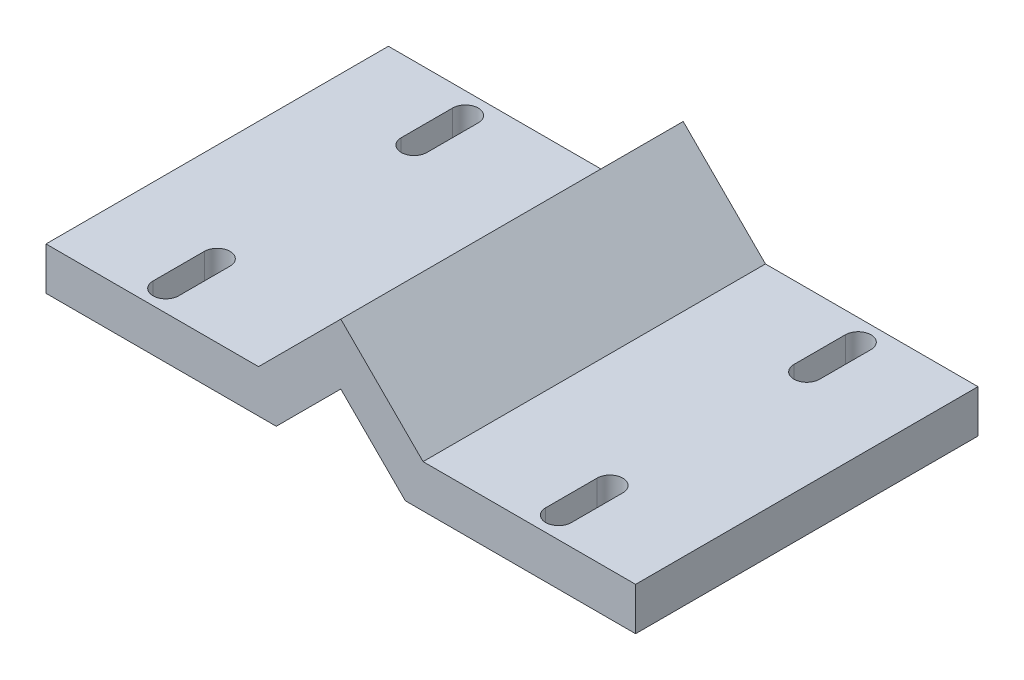
ISO-10303-21;
HEADER;
FILE_DESCRIPTION(('STEP AP214'),'2;1');
FILE_NAME('part.step','',(''),(''),'','','');
FILE_SCHEMA(('AUTOMOTIVE_DESIGN { 1 0 10303 214 1 1 1 1 }'));
ENDSEC;
DATA;
#1=APPLICATION_CONTEXT('core data for automotive mechanical design processes');
#2=APPLICATION_PROTOCOL_DEFINITION('international standard','automotive_design',2000,#1);
#3=PRODUCT_CONTEXT('',#1,'mechanical');
#4=PRODUCT('Part','Part','',(#3));
#5=PRODUCT_RELATED_PRODUCT_CATEGORY('part','',(#4));
#6=PRODUCT_DEFINITION_FORMATION('','',#4);
#7=PRODUCT_DEFINITION_CONTEXT('part definition',#1,'design');
#8=PRODUCT_DEFINITION('design','',#6,#7);
#9=PRODUCT_DEFINITION_SHAPE('','',#8);
#10=(LENGTH_UNIT() NAMED_UNIT(*) SI_UNIT(.MILLI.,.METRE.));
#11=(NAMED_UNIT(*) PLANE_ANGLE_UNIT() SI_UNIT($,.RADIAN.));
#12=(NAMED_UNIT(*) SI_UNIT($,.STERADIAN.) SOLID_ANGLE_UNIT());
#13=UNCERTAINTY_MEASURE_WITH_UNIT(LENGTH_MEASURE(1.E-05),#10,'distance_accuracy_value','');
#14=(GEOMETRIC_REPRESENTATION_CONTEXT(3) GLOBAL_UNCERTAINTY_ASSIGNED_CONTEXT((#13)) GLOBAL_UNIT_ASSIGNED_CONTEXT((#10,
#11,#12)) REPRESENTATION_CONTEXT('',''));
#15=CARTESIAN_POINT('',(0.,0.,0.));
#16=DIRECTION('',(0.,0.,1.));
#17=DIRECTION('',(1.,0.,0.));
#18=AXIS2_PLACEMENT_3D('',#15,#16,#17);
#19=CARTESIAN_POINT('',(7.53999999999993,-7.54,40.));
#20=DIRECTION('',(0.707106781186551,0.707106781186544,0.));
#21=DIRECTION('',(-0.707106781186544,0.707106781186551,0.));
#22=AXIS2_PLACEMENT_3D('',#19,#20,#21);
#23=PLANE('',#22);
#24=DIRECTION('',(0.707106781186544,-0.707106781186551,0.));
#25=VECTOR('',#24,1.);
#26=CARTESIAN_POINT('',(7.53999999999993,-7.54,0.));
#27=LINE('',#26,#25);
#28=CARTESIAN_POINT('',(0.,0.,0.));
#29=VERTEX_POINT('',#28);
#30=CARTESIAN_POINT('',(7.53999999999993,-7.54,0.));
#31=VERTEX_POINT('',#30);
#32=EDGE_CURVE('E316',#29,#31,#27,.T.);
#33=ORIENTED_EDGE('',*,*,#32,.T.);
#34=DIRECTION('',(0.,0.,-1.));
#35=VECTOR('',#34,1.);
#36=CARTESIAN_POINT('',(7.53999999999993,-7.54,40.));
#37=LINE('',#36,#35);
#38=CARTESIAN_POINT('',(7.53999999999993,-7.54,40.));
#39=VERTEX_POINT('',#38);
#40=EDGE_CURVE('E385',#39,#31,#37,.T.);
#41=ORIENTED_EDGE('',*,*,#40,.F.);
#42=DIRECTION('',(0.707106781186544,-0.707106781186551,0.));
#43=VECTOR('',#42,1.);
#44=CARTESIAN_POINT('',(7.53999999999993,-7.54,40.));
#45=LINE('',#44,#43);
#46=CARTESIAN_POINT('',(0.,0.,40.));
#47=VERTEX_POINT('',#46);
#48=EDGE_CURVE('E317',#47,#39,#45,.T.);
#49=ORIENTED_EDGE('',*,*,#48,.F.);
#50=DIRECTION('',(0.,0.,-1.));
#51=VECTOR('',#50,1.);
#52=CARTESIAN_POINT('',(0.,0.,40.));
#53=LINE('',#52,#51);
#54=EDGE_CURVE('E339',#47,#29,#53,.T.);
#55=ORIENTED_EDGE('',*,*,#54,.T.);
#56=EDGE_LOOP('',(#33,#41,#49,#55));
#57=FACE_BOUND('',#56,.T.);
#58=ADVANCED_FACE('F37',(#57),#23,.F.);
#59=CARTESIAN_POINT('',(34.4399999999999,-7.54,40.));
#60=DIRECTION('',(0.,1.,0.));
#61=DIRECTION('',(-1.,0.,0.));
#62=AXIS2_PLACEMENT_3D('',#59,#60,#61);
#63=PLANE('',#62);
#64=DIRECTION('',(0.,0.,1.));
#65=VECTOR('',#64,1.);
#66=CARTESIAN_POINT('',(24.4403153493872,-7.54,40.));
#67=LINE('',#66,#65);
#68=CARTESIAN_POINT('',(24.4403153493872,-7.54,31.5));
#69=VERTEX_POINT('',#68);
#70=CARTESIAN_POINT('',(24.4403153493872,-7.54,37.5));
#71=VERTEX_POINT('',#70);
#72=EDGE_CURVE('E311',#69,#71,#67,.T.);
#73=ORIENTED_EDGE('',*,*,#72,.F.);
#74=CARTESIAN_POINT('',(22.9399999999999,-7.54,31.5));
#75=DIRECTION('',(0.,1.,0.));
#76=DIRECTION('',(-1.,0.,0.));
#77=AXIS2_PLACEMENT_3D('',#74,#75,#76);
#78=CIRCLE('',#77,1.50031534938725);
#79=CARTESIAN_POINT('',(21.4396846506127,-7.54,31.5));
#80=VERTEX_POINT('',#79);
#81=EDGE_CURVE('E313',#69,#80,#78,.T.);
#82=ORIENTED_EDGE('',*,*,#81,.T.);
#83=DIRECTION('',(0.,0.,1.));
#84=VECTOR('',#83,1.);
#85=CARTESIAN_POINT('',(21.4396846506127,-7.54,40.));
#86=LINE('',#85,#84);
#87=CARTESIAN_POINT('',(21.4396846506127,-7.54,37.5));
#88=VERTEX_POINT('',#87);
#89=EDGE_CURVE('E305',#80,#88,#86,.T.);
#90=ORIENTED_EDGE('',*,*,#89,.T.);
#91=CARTESIAN_POINT('',(22.9399999999999,-7.54,37.5));
#92=DIRECTION('',(0.,1.,0.));
#93=DIRECTION('',(-1.,0.,0.));
#94=AXIS2_PLACEMENT_3D('',#91,#92,#93);
#95=CIRCLE('',#94,1.50031534938725);
#96=EDGE_CURVE('E308',#88,#71,#95,.T.);
#97=ORIENTED_EDGE('',*,*,#96,.T.);
#98=EDGE_LOOP('',(#73,#82,#90,#97));
#99=FACE_BOUND('',#98,.T.);
#100=CARTESIAN_POINT('',(22.9399999999999,-7.54,2.5));
#101=DIRECTION('',(0.,1.,0.));
#102=DIRECTION('',(-1.,0.,0.));
#103=AXIS2_PLACEMENT_3D('',#100,#101,#102);
#104=CIRCLE('',#103,1.50031534938725);
#105=CARTESIAN_POINT('',(24.4403153493872,-7.54,2.5));
#106=VERTEX_POINT('',#105);
#107=CARTESIAN_POINT('',(21.4396846506127,-7.54,2.5));
#108=VERTEX_POINT('',#107);
#109=EDGE_CURVE('E302',#106,#108,#104,.T.);
#110=ORIENTED_EDGE('',*,*,#109,.T.);
#111=DIRECTION('',(0.,0.,1.));
#112=VECTOR('',#111,1.);
#113=CARTESIAN_POINT('',(21.4396846506127,-7.54,40.));
#114=LINE('',#113,#112);
#115=CARTESIAN_POINT('',(21.4396846506127,-7.54,8.5));
#116=VERTEX_POINT('',#115);
#117=EDGE_CURVE('E216',#108,#116,#114,.T.);
#118=ORIENTED_EDGE('',*,*,#117,.T.);
#119=CARTESIAN_POINT('',(22.9399999999999,-7.54,8.5));
#120=DIRECTION('',(0.,1.,0.));
#121=DIRECTION('',(-1.,0.,0.));
#122=AXIS2_PLACEMENT_3D('',#119,#120,#121);
#123=CIRCLE('',#122,1.50031534938725);
#124=CARTESIAN_POINT('',(24.4403153493872,-7.54,8.5));
#125=VERTEX_POINT('',#124);
#126=EDGE_CURVE('E291',#116,#125,#123,.T.);
#127=ORIENTED_EDGE('',*,*,#126,.T.);
#128=DIRECTION('',(0.,0.,1.));
#129=VECTOR('',#128,1.);
#130=CARTESIAN_POINT('',(24.4403153493872,-7.54,40.));
#131=LINE('',#130,#129);
#132=EDGE_CURVE('E300',#106,#125,#131,.T.);
#133=ORIENTED_EDGE('',*,*,#132,.F.);
#134=EDGE_LOOP('',(#110,#118,#127,#133));
#135=FACE_BOUND('',#134,.T.);
#136=DIRECTION('',(1.,0.,0.));
#137=VECTOR('',#136,1.);
#138=CARTESIAN_POINT('',(34.4399999999999,-7.54,0.));
#139=LINE('',#138,#137);
#140=CARTESIAN_POINT('',(34.4399999999999,-7.54,0.));
#141=VERTEX_POINT('',#140);
#142=EDGE_CURVE('E342',#31,#141,#139,.T.);
#143=ORIENTED_EDGE('',*,*,#142,.T.);
#144=DIRECTION('',(0.,0.,-1.));
#145=VECTOR('',#144,1.);
#146=CARTESIAN_POINT('',(34.4399999999999,-7.54,40.));
#147=LINE('',#146,#145);
#148=CARTESIAN_POINT('',(34.4399999999999,-7.54,40.));
#149=VERTEX_POINT('',#148);
#150=EDGE_CURVE('E382',#149,#141,#147,.T.);
#151=ORIENTED_EDGE('',*,*,#150,.F.);
#152=DIRECTION('',(1.,0.,0.));
#153=VECTOR('',#152,1.);
#154=CARTESIAN_POINT('',(34.4399999999999,-7.54,40.));
#155=LINE('',#154,#153);
#156=EDGE_CURVE('E320',#39,#149,#155,.T.);
#157=ORIENTED_EDGE('',*,*,#156,.F.);
#158=ORIENTED_EDGE('',*,*,#40,.T.);
#159=EDGE_LOOP('',(#143,#151,#157,#158));
#160=FACE_BOUND('',#159,.T.);
#161=ADVANCED_FACE('F438',(#99,#135,#160),#63,.F.);
#162=CARTESIAN_POINT('',(34.4399999999999,-2.54,40.));
#163=DIRECTION('',(-1.,0.,0.));
#164=DIRECTION('',(0.,-1.,0.));
#165=AXIS2_PLACEMENT_3D('',#162,#163,#164);
#166=PLANE('',#165);
#167=DIRECTION('',(0.,1.,0.));
#168=VECTOR('',#167,1.);
#169=CARTESIAN_POINT('',(34.4399999999999,-2.54,0.));
#170=LINE('',#169,#168);
#171=CARTESIAN_POINT('',(34.4399999999999,-2.54,0.));
#172=VERTEX_POINT('',#171);
#173=EDGE_CURVE('E344',#141,#172,#170,.T.);
#174=ORIENTED_EDGE('',*,*,#173,.T.);
#175=DIRECTION('',(0.,0.,-1.));
#176=VECTOR('',#175,1.);
#177=CARTESIAN_POINT('',(34.4399999999999,-2.54,40.));
#178=LINE('',#177,#176);
#179=CARTESIAN_POINT('',(34.4399999999999,-2.54,40.));
#180=VERTEX_POINT('',#179);
#181=EDGE_CURVE('E379',#180,#172,#178,.T.);
#182=ORIENTED_EDGE('',*,*,#181,.F.);
#183=DIRECTION('',(0.,1.,0.));
#184=VECTOR('',#183,1.);
#185=CARTESIAN_POINT('',(34.4399999999999,-2.54,40.));
#186=LINE('',#185,#184);
#187=EDGE_CURVE('E323',#149,#180,#186,.T.);
#188=ORIENTED_EDGE('',*,*,#187,.F.);
#189=ORIENTED_EDGE('',*,*,#150,.T.);
#190=EDGE_LOOP('',(#174,#182,#188,#189));
#191=FACE_BOUND('',#190,.T.);
#192=ADVANCED_FACE('F443',(#191),#166,.F.);
#193=CARTESIAN_POINT('',(9.61106781186541,-2.54,40.));
#194=DIRECTION('',(0.,-1.,0.));
#195=DIRECTION('',(0.,0.,-1.));
#196=AXIS2_PLACEMENT_3D('',#193,#194,#195);
#197=PLANE('',#196);
#198=DIRECTION('',(0.,0.,1.));
#199=VECTOR('',#198,1.);
#200=CARTESIAN_POINT('',(21.4396846506127,-2.54,31.5));
#201=LINE('',#200,#199);
#202=CARTESIAN_POINT('',(21.4396846506127,-2.54,31.5));
#203=VERTEX_POINT('',#202);
#204=CARTESIAN_POINT('',(21.4396846506127,-2.54,37.5));
#205=VERTEX_POINT('',#204);
#206=EDGE_CURVE('E277',#203,#205,#201,.T.);
#207=ORIENTED_EDGE('',*,*,#206,.F.);
#208=CARTESIAN_POINT('',(22.9399999999999,-2.54,31.5));
#209=DIRECTION('',(0.,1.,0.));
#210=DIRECTION('',(0.,0.,1.));
#211=AXIS2_PLACEMENT_3D('',#208,#209,#210);
#212=CIRCLE('',#211,1.50031534938725);
#213=CARTESIAN_POINT('',(24.4403153493872,-2.54,31.5));
#214=VERTEX_POINT('',#213);
#215=EDGE_CURVE('E253',#214,#203,#212,.T.);
#216=ORIENTED_EDGE('',*,*,#215,.F.);
#217=DIRECTION('',(0.,0.,1.));
#218=VECTOR('',#217,1.);
#219=CARTESIAN_POINT('',(24.4403153493872,-2.54,31.5));
#220=LINE('',#219,#218);
#221=CARTESIAN_POINT('',(24.4403153493872,-2.54,37.5));
#222=VERTEX_POINT('',#221);
#223=EDGE_CURVE('E266',#214,#222,#220,.T.);
#224=ORIENTED_EDGE('',*,*,#223,.T.);
#225=CARTESIAN_POINT('',(22.9399999999999,-2.54,37.5));
#226=DIRECTION('',(0.,1.,0.));
#227=DIRECTION('',(0.,0.,1.));
#228=AXIS2_PLACEMENT_3D('',#225,#226,#227);
#229=CIRCLE('',#228,1.50031534938725);
#230=EDGE_CURVE('E274',#205,#222,#229,.T.);
#231=ORIENTED_EDGE('',*,*,#230,.F.);
#232=EDGE_LOOP('',(#207,#216,#224,#231));
#233=FACE_BOUND('',#232,.T.);
#234=CARTESIAN_POINT('',(22.9399999999999,-2.54,8.5));
#235=DIRECTION('',(0.,1.,0.));
#236=DIRECTION('',(0.,0.,1.));
#237=AXIS2_PLACEMENT_3D('',#234,#235,#236);
#238=CIRCLE('',#237,1.50031534938725);
#239=CARTESIAN_POINT('',(21.4396846506127,-2.54,8.5));
#240=VERTEX_POINT('',#239);
#241=CARTESIAN_POINT('',(24.4403153493872,-2.54,8.5));
#242=VERTEX_POINT('',#241);
#243=EDGE_CURVE('E235',#240,#242,#238,.T.);
#244=ORIENTED_EDGE('',*,*,#243,.F.);
#245=DIRECTION('',(0.,0.,1.));
#246=VECTOR('',#245,1.);
#247=CARTESIAN_POINT('',(21.4396846506127,-2.54,0.));
#248=LINE('',#247,#246);
#249=CARTESIAN_POINT('',(21.4396846506127,-2.54,2.5));
#250=VERTEX_POINT('',#249);
#251=EDGE_CURVE('E213',#250,#240,#248,.T.);
#252=ORIENTED_EDGE('',*,*,#251,.F.);
#253=CARTESIAN_POINT('',(22.9399999999999,-2.54,2.5));
#254=DIRECTION('',(0.,1.,0.));
#255=DIRECTION('',(0.,0.,1.));
#256=AXIS2_PLACEMENT_3D('',#253,#254,#255);
#257=CIRCLE('',#256,1.50031534938725);
#258=CARTESIAN_POINT('',(24.4403153493872,-2.54,2.5));
#259=VERTEX_POINT('',#258);
#260=EDGE_CURVE('E223',#259,#250,#257,.T.);
#261=ORIENTED_EDGE('',*,*,#260,.F.);
#262=DIRECTION('',(0.,0.,1.));
#263=VECTOR('',#262,1.);
#264=CARTESIAN_POINT('',(24.4403153493872,-2.54,0.));
#265=LINE('',#264,#263);
#266=EDGE_CURVE('E229',#259,#242,#265,.T.);
#267=ORIENTED_EDGE('',*,*,#266,.T.);
#268=EDGE_LOOP('',(#244,#252,#261,#267));
#269=FACE_BOUND('',#268,.T.);
#270=DIRECTION('',(-1.,0.,0.));
#271=VECTOR('',#270,1.);
#272=CARTESIAN_POINT('',(9.61106781186541,-2.54,0.));
#273=LINE('',#272,#271);
#274=CARTESIAN_POINT('',(9.61106781186541,-2.54,0.));
#275=VERTEX_POINT('',#274);
#276=EDGE_CURVE('E346',#172,#275,#273,.T.);
#277=ORIENTED_EDGE('',*,*,#276,.T.);
#278=DIRECTION('',(0.,0.,-1.));
#279=VECTOR('',#278,1.);
#280=CARTESIAN_POINT('',(9.61106781186541,-2.54,40.));
#281=LINE('',#280,#279);
#282=CARTESIAN_POINT('',(9.61106781186541,-2.54,40.));
#283=VERTEX_POINT('',#282);
#284=EDGE_CURVE('E376',#283,#275,#281,.T.);
#285=ORIENTED_EDGE('',*,*,#284,.F.);
#286=DIRECTION('',(-1.,0.,0.));
#287=VECTOR('',#286,1.);
#288=CARTESIAN_POINT('',(9.61106781186541,-2.54,40.));
#289=LINE('',#288,#287);
#290=EDGE_CURVE('E325',#180,#283,#289,.T.);
#291=ORIENTED_EDGE('',*,*,#290,.F.);
#292=ORIENTED_EDGE('',*,*,#181,.T.);
#293=EDGE_LOOP('',(#277,#285,#291,#292));
#294=FACE_BOUND('',#293,.T.);
#295=ADVANCED_FACE('F233',(#233,#269,#294),#197,.F.);
#296=CARTESIAN_POINT('',(0.,7.07106781186549,40.));
#297=DIRECTION('',(-0.707106781186551,-0.707106781186544,0.));
#298=DIRECTION('',(0.707106781186544,-0.707106781186551,0.));
#299=AXIS2_PLACEMENT_3D('',#296,#297,#298);
#300=PLANE('',#299);
#301=DIRECTION('',(-0.707106781186544,0.707106781186551,0.));
#302=VECTOR('',#301,1.);
#303=CARTESIAN_POINT('',(0.,7.07106781186549,0.));
#304=LINE('',#303,#302);
#305=CARTESIAN_POINT('',(0.,7.07106781186549,0.));
#306=VERTEX_POINT('',#305);
#307=EDGE_CURVE('E348',#275,#306,#304,.T.);
#308=ORIENTED_EDGE('',*,*,#307,.T.);
#309=DIRECTION('',(0.,0.,-1.));
#310=VECTOR('',#309,1.);
#311=CARTESIAN_POINT('',(0.,7.07106781186549,40.));
#312=LINE('',#311,#310);
#313=CARTESIAN_POINT('',(0.,7.07106781186549,40.));
#314=VERTEX_POINT('',#313);
#315=EDGE_CURVE('E373',#314,#306,#312,.T.);
#316=ORIENTED_EDGE('',*,*,#315,.F.);
#317=DIRECTION('',(-0.707106781186544,0.707106781186551,0.));
#318=VECTOR('',#317,1.);
#319=CARTESIAN_POINT('',(0.,7.07106781186549,40.));
#320=LINE('',#319,#318);
#321=EDGE_CURVE('E327',#283,#314,#320,.T.);
#322=ORIENTED_EDGE('',*,*,#321,.F.);
#323=ORIENTED_EDGE('',*,*,#284,.T.);
#324=EDGE_LOOP('',(#308,#316,#322,#323));
#325=FACE_BOUND('',#324,.T.);
#326=ADVANCED_FACE('F483',(#325),#300,.F.);
#327=CARTESIAN_POINT('',(-9.6110678118655,-2.54,40.));
#328=DIRECTION('',(0.707106781186546,-0.707106781186549,0.));
#329=DIRECTION('',(0.707106781186549,0.707106781186546,0.));
#330=AXIS2_PLACEMENT_3D('',#327,#328,#329);
#331=PLANE('',#330);
#332=DIRECTION('',(-0.707106781186549,-0.707106781186546,0.));
#333=VECTOR('',#332,1.);
#334=CARTESIAN_POINT('',(-9.6110678118655,-2.54,0.));
#335=LINE('',#334,#333);
#336=CARTESIAN_POINT('',(-9.6110678118655,-2.54,0.));
#337=VERTEX_POINT('',#336);
#338=EDGE_CURVE('E350',#306,#337,#335,.T.);
#339=ORIENTED_EDGE('',*,*,#338,.T.);
#340=DIRECTION('',(0.,0.,-1.));
#341=VECTOR('',#340,1.);
#342=CARTESIAN_POINT('',(-9.6110678118655,-2.54,40.));
#343=LINE('',#342,#341);
#344=CARTESIAN_POINT('',(-9.6110678118655,-2.54,40.));
#345=VERTEX_POINT('',#344);
#346=EDGE_CURVE('E370',#345,#337,#343,.T.);
#347=ORIENTED_EDGE('',*,*,#346,.F.);
#348=DIRECTION('',(-0.707106781186549,-0.707106781186546,0.));
#349=VECTOR('',#348,1.);
#350=CARTESIAN_POINT('',(-9.6110678118655,-2.54,40.));
#351=LINE('',#350,#349);
#352=EDGE_CURVE('E329',#314,#345,#351,.T.);
#353=ORIENTED_EDGE('',*,*,#352,.F.);
#354=ORIENTED_EDGE('',*,*,#315,.T.);
#355=EDGE_LOOP('',(#339,#347,#353,#354));
#356=FACE_BOUND('',#355,.T.);
#357=ADVANCED_FACE('F479',(#356),#331,.F.);
#358=CARTESIAN_POINT('',(-34.44,-2.54,40.));
#359=DIRECTION('',(0.,-1.,0.));
#360=DIRECTION('',(0.,0.,-1.));
#361=AXIS2_PLACEMENT_3D('',#358,#359,#360);
#362=PLANE('',#361);
#363=CARTESIAN_POINT('',(-22.94,-2.54,8.5));
#364=DIRECTION('',(0.,1.,0.));
#365=DIRECTION('',(0.,0.,1.));
#366=AXIS2_PLACEMENT_3D('',#363,#364,#365);
#367=CIRCLE('',#366,1.50031534938725);
#368=CARTESIAN_POINT('',(-24.4403153493873,-2.54,8.5));
#369=VERTEX_POINT('',#368);
#370=CARTESIAN_POINT('',(-21.4396846506128,-2.54,8.5));
#371=VERTEX_POINT('',#370);
#372=EDGE_CURVE('E259',#369,#371,#367,.T.);
#373=ORIENTED_EDGE('',*,*,#372,.F.);
#374=DIRECTION('',(0.,0.,1.));
#375=VECTOR('',#374,1.);
#376=CARTESIAN_POINT('',(-24.4403153493873,-2.54,0.));
#377=LINE('',#376,#375);
#378=CARTESIAN_POINT('',(-24.4403153493873,-2.54,2.5));
#379=VERTEX_POINT('',#378);
#380=EDGE_CURVE('E220',#379,#369,#377,.T.);
#381=ORIENTED_EDGE('',*,*,#380,.F.);
#382=CARTESIAN_POINT('',(-22.94,-2.54,2.5));
#383=DIRECTION('',(0.,1.,0.));
#384=DIRECTION('',(0.,0.,1.));
#385=AXIS2_PLACEMENT_3D('',#382,#383,#384);
#386=CIRCLE('',#385,1.50031534938725);
#387=CARTESIAN_POINT('',(-21.4396846506128,-2.54,2.5));
#388=VERTEX_POINT('',#387);
#389=EDGE_CURVE('E246',#388,#379,#386,.T.);
#390=ORIENTED_EDGE('',*,*,#389,.F.);
#391=DIRECTION('',(0.,0.,1.));
#392=VECTOR('',#391,1.);
#393=CARTESIAN_POINT('',(-21.4396846506128,-2.54,0.));
#394=LINE('',#393,#392);
#395=EDGE_CURVE('E256',#388,#371,#394,.T.);
#396=ORIENTED_EDGE('',*,*,#395,.T.);
#397=EDGE_LOOP('',(#373,#381,#390,#396));
#398=FACE_BOUND('',#397,.T.);
#399=CARTESIAN_POINT('',(-22.94,-2.54,37.5));
#400=DIRECTION('',(0.,1.,0.));
#401=DIRECTION('',(0.,0.,1.));
#402=AXIS2_PLACEMENT_3D('',#399,#400,#401);
#403=CIRCLE('',#402,1.50031534938725);
#404=CARTESIAN_POINT('',(-24.4403153493873,-2.54,37.5));
#405=VERTEX_POINT('',#404);
#406=CARTESIAN_POINT('',(-21.4396846506128,-2.54,37.5));
#407=VERTEX_POINT('',#406);
#408=EDGE_CURVE('E238',#405,#407,#403,.T.);
#409=ORIENTED_EDGE('',*,*,#408,.F.);
#410=DIRECTION('',(0.,0.,1.));
#411=VECTOR('',#410,1.);
#412=CARTESIAN_POINT('',(-24.4403153493873,-2.54,0.));
#413=LINE('',#412,#411);
#414=CARTESIAN_POINT('',(-24.4403153493873,-2.54,31.5));
#415=VERTEX_POINT('',#414);
#416=EDGE_CURVE('E236',#415,#405,#413,.T.);
#417=ORIENTED_EDGE('',*,*,#416,.F.);
#418=CARTESIAN_POINT('',(-22.94,-2.54,31.5));
#419=DIRECTION('',(0.,1.,0.));
#420=DIRECTION('',(0.,0.,1.));
#421=AXIS2_PLACEMENT_3D('',#418,#419,#420);
#422=CIRCLE('',#421,1.50031534938725);
#423=CARTESIAN_POINT('',(-21.4396846506128,-2.54,31.5));
#424=VERTEX_POINT('',#423);
#425=EDGE_CURVE('E285',#424,#415,#422,.T.);
#426=ORIENTED_EDGE('',*,*,#425,.F.);
#427=DIRECTION('',(0.,0.,1.));
#428=VECTOR('',#427,1.);
#429=CARTESIAN_POINT('',(-21.4396846506128,-2.54,0.));
#430=LINE('',#429,#428);
#431=EDGE_CURVE('E282',#424,#407,#430,.T.);
#432=ORIENTED_EDGE('',*,*,#431,.T.);
#433=EDGE_LOOP('',(#409,#417,#426,#432));
#434=FACE_BOUND('',#433,.T.);
#435=DIRECTION('',(-1.,0.,0.));
#436=VECTOR('',#435,1.);
#437=CARTESIAN_POINT('',(-34.44,-2.54,0.));
#438=LINE('',#437,#436);
#439=CARTESIAN_POINT('',(-34.44,-2.54,0.));
#440=VERTEX_POINT('',#439);
#441=EDGE_CURVE('E352',#337,#440,#438,.T.);
#442=ORIENTED_EDGE('',*,*,#441,.T.);
#443=DIRECTION('',(0.,0.,-1.));
#444=VECTOR('',#443,1.);
#445=CARTESIAN_POINT('',(-34.44,-2.54,40.));
#446=LINE('',#445,#444);
#447=CARTESIAN_POINT('',(-34.44,-2.54,40.));
#448=VERTEX_POINT('',#447);
#449=EDGE_CURVE('E367',#448,#440,#446,.T.);
#450=ORIENTED_EDGE('',*,*,#449,.F.);
#451=DIRECTION('',(-1.,0.,0.));
#452=VECTOR('',#451,1.);
#453=CARTESIAN_POINT('',(-34.44,-2.54,40.));
#454=LINE('',#453,#452);
#455=EDGE_CURVE('E331',#345,#448,#454,.T.);
#456=ORIENTED_EDGE('',*,*,#455,.F.);
#457=ORIENTED_EDGE('',*,*,#346,.T.);
#458=EDGE_LOOP('',(#442,#450,#456,#457));
#459=FACE_BOUND('',#458,.T.);
#460=ADVANCED_FACE('F421',(#398,#434,#459),#362,.F.);
#461=CARTESIAN_POINT('',(-34.44,-7.54,40.));
#462=DIRECTION('',(1.,0.,0.));
#463=DIRECTION('',(0.,0.,-1.));
#464=AXIS2_PLACEMENT_3D('',#461,#462,#463);
#465=PLANE('',#464);
#466=DIRECTION('',(0.,-1.,0.));
#467=VECTOR('',#466,1.);
#468=CARTESIAN_POINT('',(-34.44,-7.54,0.));
#469=LINE('',#468,#467);
#470=CARTESIAN_POINT('',(-34.44,-7.54,0.));
#471=VERTEX_POINT('',#470);
#472=EDGE_CURVE('E354',#440,#471,#469,.T.);
#473=ORIENTED_EDGE('',*,*,#472,.T.);
#474=DIRECTION('',(0.,0.,-1.));
#475=VECTOR('',#474,1.);
#476=CARTESIAN_POINT('',(-34.44,-7.54,40.));
#477=LINE('',#476,#475);
#478=CARTESIAN_POINT('',(-34.44,-7.54,40.));
#479=VERTEX_POINT('',#478);
#480=EDGE_CURVE('E364',#479,#471,#477,.T.);
#481=ORIENTED_EDGE('',*,*,#480,.F.);
#482=DIRECTION('',(0.,-1.,0.));
#483=VECTOR('',#482,1.);
#484=CARTESIAN_POINT('',(-34.44,-7.54,40.));
#485=LINE('',#484,#483);
#486=EDGE_CURVE('E333',#448,#479,#485,.T.);
#487=ORIENTED_EDGE('',*,*,#486,.F.);
#488=ORIENTED_EDGE('',*,*,#449,.T.);
#489=EDGE_LOOP('',(#473,#481,#487,#488));
#490=FACE_BOUND('',#489,.T.);
#491=ADVANCED_FACE('F471',(#490),#465,.F.);
#492=CARTESIAN_POINT('',(-7.54000000000002,-7.54,40.));
#493=DIRECTION('',(0.,1.,0.));
#494=DIRECTION('',(-1.,0.,0.));
#495=AXIS2_PLACEMENT_3D('',#492,#493,#494);
#496=PLANE('',#495);
#497=CARTESIAN_POINT('',(-22.94,-7.54,2.5));
#498=DIRECTION('',(0.,1.,0.));
#499=DIRECTION('',(-1.,0.,0.));
#500=AXIS2_PLACEMENT_3D('',#497,#498,#499);
#501=CIRCLE('',#500,1.50031534938725);
#502=CARTESIAN_POINT('',(-21.4396846506128,-7.54,2.5));
#503=VERTEX_POINT('',#502);
#504=CARTESIAN_POINT('',(-24.4403153493873,-7.54,2.5));
#505=VERTEX_POINT('',#504);
#506=EDGE_CURVE('E44',#503,#505,#501,.T.);
#507=ORIENTED_EDGE('',*,*,#506,.T.);
#508=DIRECTION('',(0.,0.,1.));
#509=VECTOR('',#508,1.);
#510=CARTESIAN_POINT('',(-24.4403153493873,-7.54,40.));
#511=LINE('',#510,#509);
#512=CARTESIAN_POINT('',(-24.4403153493873,-7.54,8.5));
#513=VERTEX_POINT('',#512);
#514=EDGE_CURVE('E11',#505,#513,#511,.T.);
#515=ORIENTED_EDGE('',*,*,#514,.T.);
#516=CARTESIAN_POINT('',(-22.94,-7.54,8.5));
#517=DIRECTION('',(0.,1.,0.));
#518=DIRECTION('',(-1.,0.,0.));
#519=AXIS2_PLACEMENT_3D('',#516,#517,#518);
#520=CIRCLE('',#519,1.50031534938725);
#521=CARTESIAN_POINT('',(-21.4396846506128,-7.54,8.5));
#522=VERTEX_POINT('',#521);
#523=EDGE_CURVE('E400',#513,#522,#520,.T.);
#524=ORIENTED_EDGE('',*,*,#523,.T.);
#525=DIRECTION('',(0.,0.,1.));
#526=VECTOR('',#525,1.);
#527=CARTESIAN_POINT('',(-21.4396846506128,-7.54,40.));
#528=LINE('',#527,#526);
#529=EDGE_CURVE('E403',#503,#522,#528,.T.);
#530=ORIENTED_EDGE('',*,*,#529,.F.);
#531=EDGE_LOOP('',(#507,#515,#524,#530));
#532=FACE_BOUND('',#531,.T.);
#533=CARTESIAN_POINT('',(-22.94,-7.54,31.5));
#534=DIRECTION('',(0.,1.,0.));
#535=DIRECTION('',(-1.,0.,0.));
#536=AXIS2_PLACEMENT_3D('',#533,#534,#535);
#537=CIRCLE('',#536,1.50031534938725);
#538=CARTESIAN_POINT('',(-21.4396846506128,-7.54,31.5));
#539=VERTEX_POINT('',#538);
#540=CARTESIAN_POINT('',(-24.4403153493873,-7.54,31.5));
#541=VERTEX_POINT('',#540);
#542=EDGE_CURVE('E394',#539,#541,#537,.T.);
#543=ORIENTED_EDGE('',*,*,#542,.T.);
#544=DIRECTION('',(0.,0.,1.));
#545=VECTOR('',#544,1.);
#546=CARTESIAN_POINT('',(-24.4403153493873,-7.54,40.));
#547=LINE('',#546,#545);
#548=CARTESIAN_POINT('',(-24.4403153493873,-7.54,37.5));
#549=VERTEX_POINT('',#548);
#550=EDGE_CURVE('E397',#541,#549,#547,.T.);
#551=ORIENTED_EDGE('',*,*,#550,.T.);
#552=CARTESIAN_POINT('',(-22.94,-7.54,37.5));
#553=DIRECTION('',(0.,1.,0.));
#554=DIRECTION('',(-1.,0.,0.));
#555=AXIS2_PLACEMENT_3D('',#552,#553,#554);
#556=CIRCLE('',#555,1.50031534938725);
#557=CARTESIAN_POINT('',(-21.4396846506128,-7.54,37.5));
#558=VERTEX_POINT('',#557);
#559=EDGE_CURVE('E388',#549,#558,#556,.T.);
#560=ORIENTED_EDGE('',*,*,#559,.T.);
#561=DIRECTION('',(0.,0.,1.));
#562=VECTOR('',#561,1.);
#563=CARTESIAN_POINT('',(-21.4396846506128,-7.54,40.));
#564=LINE('',#563,#562);
#565=EDGE_CURVE('E391',#539,#558,#564,.T.);
#566=ORIENTED_EDGE('',*,*,#565,.F.);
#567=EDGE_LOOP('',(#543,#551,#560,#566));
#568=FACE_BOUND('',#567,.T.);
#569=DIRECTION('',(1.,0.,0.));
#570=VECTOR('',#569,1.);
#571=CARTESIAN_POINT('',(-7.54000000000002,-7.54,0.));
#572=LINE('',#571,#570);
#573=CARTESIAN_POINT('',(-7.54000000000002,-7.54,0.));
#574=VERTEX_POINT('',#573);
#575=EDGE_CURVE('E356',#471,#574,#572,.T.);
#576=ORIENTED_EDGE('',*,*,#575,.T.);
#577=DIRECTION('',(0.,0.,-1.));
#578=VECTOR('',#577,1.);
#579=CARTESIAN_POINT('',(-7.54000000000002,-7.54,40.));
#580=LINE('',#579,#578);
#581=CARTESIAN_POINT('',(-7.54000000000002,-7.54,40.));
#582=VERTEX_POINT('',#581);
#583=EDGE_CURVE('E361',#582,#574,#580,.T.);
#584=ORIENTED_EDGE('',*,*,#583,.F.);
#585=DIRECTION('',(1.,0.,0.));
#586=VECTOR('',#585,1.);
#587=CARTESIAN_POINT('',(-7.54000000000002,-7.54,40.));
#588=LINE('',#587,#586);
#589=EDGE_CURVE('E335',#479,#582,#588,.T.);
#590=ORIENTED_EDGE('',*,*,#589,.F.);
#591=ORIENTED_EDGE('',*,*,#480,.T.);
#592=EDGE_LOOP('',(#576,#584,#590,#591));
#593=FACE_BOUND('',#592,.T.);
#594=ADVANCED_FACE('F408',(#532,#568,#593),#496,.F.);
#595=CARTESIAN_POINT('',(0.,0.,40.));
#596=DIRECTION('',(-0.707106781186547,0.707106781186549,0.));
#597=DIRECTION('',(-0.707106781186549,-0.707106781186546,0.));
#598=AXIS2_PLACEMENT_3D('',#595,#596,#597);
#599=PLANE('',#598);
#600=DIRECTION('',(0.707106781186549,0.707106781186547,0.));
#601=VECTOR('',#600,1.);
#602=CARTESIAN_POINT('',(0.,0.,0.));
#603=LINE('',#602,#601);
#604=EDGE_CURVE('E321',#574,#29,#603,.T.);
#605=ORIENTED_EDGE('',*,*,#604,.T.);
#606=ORIENTED_EDGE('',*,*,#54,.F.);
#607=DIRECTION('',(0.707106781186549,0.707106781186547,0.));
#608=VECTOR('',#607,1.);
#609=CARTESIAN_POINT('',(0.,0.,40.));
#610=LINE('',#609,#608);
#611=EDGE_CURVE('E337',#582,#47,#610,.T.);
#612=ORIENTED_EDGE('',*,*,#611,.F.);
#613=ORIENTED_EDGE('',*,*,#583,.T.);
#614=EDGE_LOOP('',(#605,#606,#612,#613));
#615=FACE_BOUND('',#614,.T.);
#616=ADVANCED_FACE('F464',(#615),#599,.F.);
#617=CARTESIAN_POINT('',(0.,0.,40.));
#618=DIRECTION('',(0.,0.,1.));
#619=DIRECTION('',(1.,0.,0.));
#620=AXIS2_PLACEMENT_3D('',#617,#618,#619);
#621=PLANE('',#620);
#622=ORIENTED_EDGE('',*,*,#48,.T.);
#623=ORIENTED_EDGE('',*,*,#156,.T.);
#624=ORIENTED_EDGE('',*,*,#187,.T.);
#625=ORIENTED_EDGE('',*,*,#290,.T.);
#626=ORIENTED_EDGE('',*,*,#321,.T.);
#627=ORIENTED_EDGE('',*,*,#352,.T.);
#628=ORIENTED_EDGE('',*,*,#455,.T.);
#629=ORIENTED_EDGE('',*,*,#486,.T.);
#630=ORIENTED_EDGE('',*,*,#589,.T.);
#631=ORIENTED_EDGE('',*,*,#611,.T.);
#632=EDGE_LOOP('',(#622,#623,#624,#625,#626,#627,#628,#629,#630,#631));
#633=FACE_BOUND('',#632,.T.);
#634=ADVANCED_FACE('F459',(#633),#621,.T.);
#635=CARTESIAN_POINT('',(0.,0.,0.));
#636=DIRECTION('',(0.,0.,1.));
#637=DIRECTION('',(1.,0.,0.));
#638=AXIS2_PLACEMENT_3D('',#635,#636,#637);
#639=PLANE('',#638);
#640=ORIENTED_EDGE('',*,*,#32,.F.);
#641=ORIENTED_EDGE('',*,*,#604,.F.);
#642=ORIENTED_EDGE('',*,*,#575,.F.);
#643=ORIENTED_EDGE('',*,*,#472,.F.);
#644=ORIENTED_EDGE('',*,*,#441,.F.);
#645=ORIENTED_EDGE('',*,*,#338,.F.);
#646=ORIENTED_EDGE('',*,*,#307,.F.);
#647=ORIENTED_EDGE('',*,*,#276,.F.);
#648=ORIENTED_EDGE('',*,*,#173,.F.);
#649=ORIENTED_EDGE('',*,*,#142,.F.);
#650=EDGE_LOOP('',(#640,#641,#642,#643,#644,#645,#646,#647,#648,#649));
#651=FACE_BOUND('',#650,.T.);
#652=ADVANCED_FACE('F451',(#651),#639,.F.);
#653=CARTESIAN_POINT('',(-24.4403153493873,-12.54,0.));
#654=DIRECTION('',(-1.,0.,0.));
#655=DIRECTION('',(0.,0.,1.));
#656=AXIS2_PLACEMENT_3D('',#653,#654,#655);
#657=PLANE('',#656);
#658=DIRECTION('',(0.,1.,0.));
#659=VECTOR('',#658,1.);
#660=CARTESIAN_POINT('',(-24.4403153493873,-12.54,31.5));
#661=LINE('',#660,#659);
#662=EDGE_CURVE('E289',#541,#415,#661,.T.);
#663=ORIENTED_EDGE('',*,*,#662,.T.);
#664=ORIENTED_EDGE('',*,*,#416,.T.);
#665=DIRECTION('',(0.,1.,0.));
#666=VECTOR('',#665,1.);
#667=CARTESIAN_POINT('',(-24.4403153493873,-12.54,37.5));
#668=LINE('',#667,#666);
#669=EDGE_CURVE('E288',#549,#405,#668,.T.);
#670=ORIENTED_EDGE('',*,*,#669,.F.);
#671=ORIENTED_EDGE('',*,*,#550,.F.);
#672=EDGE_LOOP('',(#663,#664,#670,#671));
#673=FACE_BOUND('',#672,.T.);
#674=ADVANCED_FACE('F511',(#673),#657,.F.);
#675=CARTESIAN_POINT('',(-22.94,-12.54,31.5));
#676=DIRECTION('',(0.,1.,0.));
#677=DIRECTION('',(0.,0.,1.));
#678=AXIS2_PLACEMENT_3D('',#675,#676,#677);
#679=CYLINDRICAL_SURFACE('',#678,1.50031534938725);
#680=DIRECTION('',(0.,1.,0.));
#681=VECTOR('',#680,1.);
#682=CARTESIAN_POINT('',(-21.4396846506128,-12.54,31.5));
#683=LINE('',#682,#681);
#684=EDGE_CURVE('E292',#539,#424,#683,.T.);
#685=ORIENTED_EDGE('',*,*,#684,.T.);
#686=ORIENTED_EDGE('',*,*,#425,.T.);
#687=ORIENTED_EDGE('',*,*,#662,.F.);
#688=ORIENTED_EDGE('',*,*,#542,.F.);
#689=EDGE_LOOP('',(#685,#686,#687,#688));
#690=FACE_BOUND('',#689,.T.);
#691=ADVANCED_FACE('F516',(#690),#679,.F.);
#692=CARTESIAN_POINT('',(-21.4396846506128,-12.54,0.));
#693=DIRECTION('',(-1.,0.,0.));
#694=DIRECTION('',(0.,0.,1.));
#695=AXIS2_PLACEMENT_3D('',#692,#693,#694);
#696=PLANE('',#695);
#697=ORIENTED_EDGE('',*,*,#565,.T.);
#698=DIRECTION('',(0.,1.,0.));
#699=VECTOR('',#698,1.);
#700=CARTESIAN_POINT('',(-21.4396846506128,-12.54,37.5));
#701=LINE('',#700,#699);
#702=EDGE_CURVE('E294',#558,#407,#701,.T.);
#703=ORIENTED_EDGE('',*,*,#702,.T.);
#704=ORIENTED_EDGE('',*,*,#431,.F.);
#705=ORIENTED_EDGE('',*,*,#684,.F.);
#706=EDGE_LOOP('',(#697,#703,#704,#705));
#707=FACE_BOUND('',#706,.T.);
#708=ADVANCED_FACE('F521',(#707),#696,.T.);
#709=CARTESIAN_POINT('',(-22.94,-12.54,37.5));
#710=DIRECTION('',(0.,1.,0.));
#711=DIRECTION('',(0.,0.,1.));
#712=AXIS2_PLACEMENT_3D('',#709,#710,#711);
#713=CYLINDRICAL_SURFACE('',#712,1.50031534938725);
#714=ORIENTED_EDGE('',*,*,#669,.T.);
#715=ORIENTED_EDGE('',*,*,#408,.T.);
#716=ORIENTED_EDGE('',*,*,#702,.F.);
#717=ORIENTED_EDGE('',*,*,#559,.F.);
#718=EDGE_LOOP('',(#714,#715,#716,#717));
#719=FACE_BOUND('',#718,.T.);
#720=ADVANCED_FACE('F518',(#719),#713,.F.);
#721=CARTESIAN_POINT('',(-24.4403153493873,-12.54,0.));
#722=DIRECTION('',(-1.,0.,0.));
#723=DIRECTION('',(0.,0.,1.));
#724=AXIS2_PLACEMENT_3D('',#721,#722,#723);
#725=PLANE('',#724);
#726=DIRECTION('',(0.,1.,0.));
#727=VECTOR('',#726,1.);
#728=CARTESIAN_POINT('',(-24.4403153493873,-12.54,2.5));
#729=LINE('',#728,#727);
#730=EDGE_CURVE('E251',#505,#379,#729,.T.);
#731=ORIENTED_EDGE('',*,*,#730,.T.);
#732=ORIENTED_EDGE('',*,*,#380,.T.);
#733=DIRECTION('',(0.,1.,0.));
#734=VECTOR('',#733,1.);
#735=CARTESIAN_POINT('',(-24.4403153493873,-12.54,8.5));
#736=LINE('',#735,#734);
#737=EDGE_CURVE('E243',#513,#369,#736,.T.);
#738=ORIENTED_EDGE('',*,*,#737,.F.);
#739=ORIENTED_EDGE('',*,*,#514,.F.);
#740=EDGE_LOOP('',(#731,#732,#738,#739));
#741=FACE_BOUND('',#740,.T.);
#742=ADVANCED_FACE('F425',(#741),#725,.F.);
#743=CARTESIAN_POINT('',(-22.94,-12.54,2.5));
#744=DIRECTION('',(0.,1.,0.));
#745=DIRECTION('',(0.,0.,1.));
#746=AXIS2_PLACEMENT_3D('',#743,#744,#745);
#747=CYLINDRICAL_SURFACE('',#746,1.50031534938725);
#748=DIRECTION('',(0.,1.,0.));
#749=VECTOR('',#748,1.);
#750=CARTESIAN_POINT('',(-21.4396846506128,-12.54,2.5));
#751=LINE('',#750,#749);
#752=EDGE_CURVE('E249',#503,#388,#751,.T.);
#753=ORIENTED_EDGE('',*,*,#752,.T.);
#754=ORIENTED_EDGE('',*,*,#389,.T.);
#755=ORIENTED_EDGE('',*,*,#730,.F.);
#756=ORIENTED_EDGE('',*,*,#506,.F.);
#757=EDGE_LOOP('',(#753,#754,#755,#756));
#758=FACE_BOUND('',#757,.T.);
#759=ADVANCED_FACE('F413',(#758),#747,.F.);
#760=CARTESIAN_POINT('',(-21.4396846506128,-12.54,0.));
#761=DIRECTION('',(-1.,0.,0.));
#762=DIRECTION('',(0.,0.,1.));
#763=AXIS2_PLACEMENT_3D('',#760,#761,#762);
#764=PLANE('',#763);
#765=ORIENTED_EDGE('',*,*,#529,.T.);
#766=DIRECTION('',(0.,1.,0.));
#767=VECTOR('',#766,1.);
#768=CARTESIAN_POINT('',(-21.4396846506128,-12.54,8.5));
#769=LINE('',#768,#767);
#770=EDGE_CURVE('E247',#522,#371,#769,.T.);
#771=ORIENTED_EDGE('',*,*,#770,.T.);
#772=ORIENTED_EDGE('',*,*,#395,.F.);
#773=ORIENTED_EDGE('',*,*,#752,.F.);
#774=EDGE_LOOP('',(#765,#771,#772,#773));
#775=FACE_BOUND('',#774,.T.);
#776=ADVANCED_FACE('F416',(#775),#764,.T.);
#777=CARTESIAN_POINT('',(-22.94,-12.54,8.5));
#778=DIRECTION('',(0.,1.,0.));
#779=DIRECTION('',(0.,0.,1.));
#780=AXIS2_PLACEMENT_3D('',#777,#778,#779);
#781=CYLINDRICAL_SURFACE('',#780,1.50031534938725);
#782=ORIENTED_EDGE('',*,*,#737,.T.);
#783=ORIENTED_EDGE('',*,*,#372,.T.);
#784=ORIENTED_EDGE('',*,*,#770,.F.);
#785=ORIENTED_EDGE('',*,*,#523,.F.);
#786=EDGE_LOOP('',(#782,#783,#784,#785));
#787=FACE_BOUND('',#786,.T.);
#788=ADVANCED_FACE('F427',(#787),#781,.F.);
#789=CARTESIAN_POINT('',(21.4396846506127,-12.54,0.));
#790=DIRECTION('',(-1.,0.,0.));
#791=DIRECTION('',(0.,0.,1.));
#792=AXIS2_PLACEMENT_3D('',#789,#790,#791);
#793=PLANE('',#792);
#794=DIRECTION('',(0.,1.,0.));
#795=VECTOR('',#794,1.);
#796=CARTESIAN_POINT('',(21.4396846506127,-12.54,2.5));
#797=LINE('',#796,#795);
#798=EDGE_CURVE('E208',#108,#250,#797,.T.);
#799=ORIENTED_EDGE('',*,*,#798,.T.);
#800=ORIENTED_EDGE('',*,*,#251,.T.);
#801=DIRECTION('',(0.,1.,0.));
#802=VECTOR('',#801,1.);
#803=CARTESIAN_POINT('',(21.4396846506127,-12.54,8.5));
#804=LINE('',#803,#802);
#805=EDGE_CURVE('E230',#116,#240,#804,.T.);
#806=ORIENTED_EDGE('',*,*,#805,.F.);
#807=ORIENTED_EDGE('',*,*,#117,.F.);
#808=EDGE_LOOP('',(#799,#800,#806,#807));
#809=FACE_BOUND('',#808,.T.);
#810=ADVANCED_FACE('F210',(#809),#793,.F.);
#811=CARTESIAN_POINT('',(22.9399999999999,-12.54,2.5));
#812=DIRECTION('',(0.,1.,0.));
#813=DIRECTION('',(0.,0.,1.));
#814=AXIS2_PLACEMENT_3D('',#811,#812,#813);
#815=CYLINDRICAL_SURFACE('',#814,1.50031534938725);
#816=DIRECTION('',(0.,1.,0.));
#817=VECTOR('',#816,1.);
#818=CARTESIAN_POINT('',(24.4403153493872,-12.54,2.5));
#819=LINE('',#818,#817);
#820=EDGE_CURVE('E219',#106,#259,#819,.T.);
#821=ORIENTED_EDGE('',*,*,#820,.T.);
#822=ORIENTED_EDGE('',*,*,#260,.T.);
#823=ORIENTED_EDGE('',*,*,#798,.F.);
#824=ORIENTED_EDGE('',*,*,#109,.F.);
#825=EDGE_LOOP('',(#821,#822,#823,#824));
#826=FACE_BOUND('',#825,.T.);
#827=ADVANCED_FACE('F224',(#826),#815,.F.);
#828=CARTESIAN_POINT('',(24.4403153493872,-12.54,0.));
#829=DIRECTION('',(-1.,0.,0.));
#830=DIRECTION('',(0.,0.,1.));
#831=AXIS2_PLACEMENT_3D('',#828,#829,#830);
#832=PLANE('',#831);
#833=ORIENTED_EDGE('',*,*,#132,.T.);
#834=DIRECTION('',(0.,1.,0.));
#835=VECTOR('',#834,1.);
#836=CARTESIAN_POINT('',(24.4403153493872,-12.54,8.5));
#837=LINE('',#836,#835);
#838=EDGE_CURVE('E59',#125,#242,#837,.T.);
#839=ORIENTED_EDGE('',*,*,#838,.T.);
#840=ORIENTED_EDGE('',*,*,#266,.F.);
#841=ORIENTED_EDGE('',*,*,#820,.F.);
#842=EDGE_LOOP('',(#833,#839,#840,#841));
#843=FACE_BOUND('',#842,.T.);
#844=ADVANCED_FACE('F554',(#843),#832,.T.);
#845=CARTESIAN_POINT('',(22.9399999999999,-12.54,8.5));
#846=DIRECTION('',(0.,1.,0.));
#847=DIRECTION('',(0.,0.,1.));
#848=AXIS2_PLACEMENT_3D('',#845,#846,#847);
#849=CYLINDRICAL_SURFACE('',#848,1.50031534938725);
#850=ORIENTED_EDGE('',*,*,#805,.T.);
#851=ORIENTED_EDGE('',*,*,#243,.T.);
#852=ORIENTED_EDGE('',*,*,#838,.F.);
#853=ORIENTED_EDGE('',*,*,#126,.F.);
#854=EDGE_LOOP('',(#850,#851,#852,#853));
#855=FACE_BOUND('',#854,.T.);
#856=ADVANCED_FACE('F543',(#855),#849,.F.);
#857=CARTESIAN_POINT('',(22.9399999999999,-12.54,31.5));
#858=DIRECTION('',(0.,1.,0.));
#859=DIRECTION('',(0.,0.,1.));
#860=AXIS2_PLACEMENT_3D('',#857,#858,#859);
#861=CYLINDRICAL_SURFACE('',#860,1.50031534938725);
#862=DIRECTION('',(0.,1.,0.));
#863=VECTOR('',#862,1.);
#864=CARTESIAN_POINT('',(24.4403153493872,-12.54,31.5));
#865=LINE('',#864,#863);
#866=EDGE_CURVE('E270',#69,#214,#865,.T.);
#867=ORIENTED_EDGE('',*,*,#866,.T.);
#868=ORIENTED_EDGE('',*,*,#215,.T.);
#869=DIRECTION('',(0.,1.,0.));
#870=VECTOR('',#869,1.);
#871=CARTESIAN_POINT('',(21.4396846506127,-12.54,31.5));
#872=LINE('',#871,#870);
#873=EDGE_CURVE('E263',#80,#203,#872,.T.);
#874=ORIENTED_EDGE('',*,*,#873,.F.);
#875=ORIENTED_EDGE('',*,*,#81,.F.);
#876=EDGE_LOOP('',(#867,#868,#874,#875));
#877=FACE_BOUND('',#876,.T.);
#878=ADVANCED_FACE('F533',(#877),#861,.F.);
#879=CARTESIAN_POINT('',(24.4403153493872,-12.54,31.5));
#880=DIRECTION('',(-1.,0.,0.));
#881=DIRECTION('',(0.,0.,1.));
#882=AXIS2_PLACEMENT_3D('',#879,#880,#881);
#883=PLANE('',#882);
#884=ORIENTED_EDGE('',*,*,#72,.T.);
#885=DIRECTION('',(0.,1.,0.));
#886=VECTOR('',#885,1.);
#887=CARTESIAN_POINT('',(24.4403153493872,-12.54,37.5));
#888=LINE('',#887,#886);
#889=EDGE_CURVE('E268',#71,#222,#888,.T.);
#890=ORIENTED_EDGE('',*,*,#889,.T.);
#891=ORIENTED_EDGE('',*,*,#223,.F.);
#892=ORIENTED_EDGE('',*,*,#866,.F.);
#893=EDGE_LOOP('',(#884,#890,#891,#892));
#894=FACE_BOUND('',#893,.T.);
#895=ADVANCED_FACE('F529',(#894),#883,.T.);
#896=CARTESIAN_POINT('',(22.9399999999999,-12.54,37.5));
#897=DIRECTION('',(0.,1.,0.));
#898=DIRECTION('',(0.,0.,1.));
#899=AXIS2_PLACEMENT_3D('',#896,#897,#898);
#900=CYLINDRICAL_SURFACE('',#899,1.50031534938725);
#901=DIRECTION('',(0.,1.,0.));
#902=VECTOR('',#901,1.);
#903=CARTESIAN_POINT('',(21.4396846506127,-12.54,37.5));
#904=LINE('',#903,#902);
#905=EDGE_CURVE('E51',#88,#205,#904,.T.);
#906=ORIENTED_EDGE('',*,*,#905,.T.);
#907=ORIENTED_EDGE('',*,*,#230,.T.);
#908=ORIENTED_EDGE('',*,*,#889,.F.);
#909=ORIENTED_EDGE('',*,*,#96,.F.);
#910=EDGE_LOOP('',(#906,#907,#908,#909));
#911=FACE_BOUND('',#910,.T.);
#912=ADVANCED_FACE('F532',(#911),#900,.F.);
#913=CARTESIAN_POINT('',(21.4396846506127,-12.54,31.5));
#914=DIRECTION('',(-1.,0.,0.));
#915=DIRECTION('',(0.,0.,1.));
#916=AXIS2_PLACEMENT_3D('',#913,#914,#915);
#917=PLANE('',#916);
#918=ORIENTED_EDGE('',*,*,#873,.T.);
#919=ORIENTED_EDGE('',*,*,#206,.T.);
#920=ORIENTED_EDGE('',*,*,#905,.F.);
#921=ORIENTED_EDGE('',*,*,#89,.F.);
#922=EDGE_LOOP('',(#918,#919,#920,#921));
#923=FACE_BOUND('',#922,.T.);
#924=ADVANCED_FACE('F537',(#923),#917,.F.);
#925=CLOSED_SHELL('',(#58,#161,#192,#295,#326,#357,#460,#491,#594,#616,#634,#652,#674,#691,#708,
#720,#742,#759,#776,#788,#810,#827,#844,#856,#878,#895,#912,#924));
#926=MANIFOLD_SOLID_BREP('B2',#925);
#927=ADVANCED_BREP_SHAPE_REPRESENTATION('',(#18,#926),#14);
#928=SHAPE_DEFINITION_REPRESENTATION(#9,#927);
ENDSEC;
END-ISO-10303-21;
